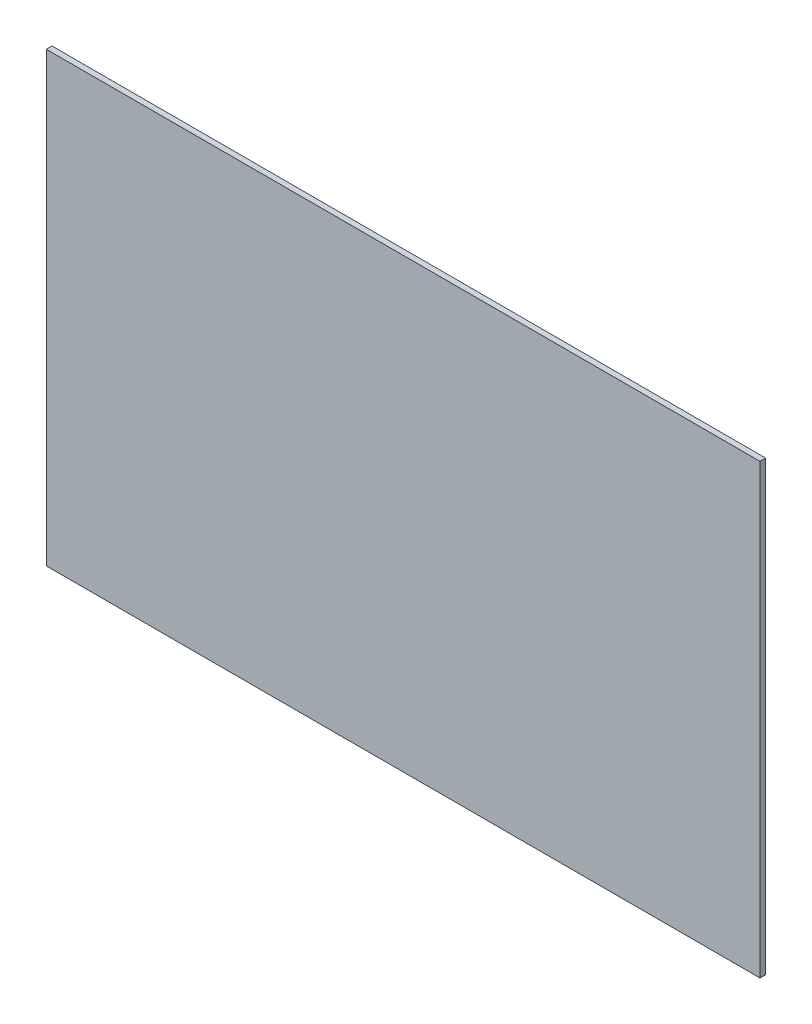
ISO-10303-21;
HEADER;
FILE_DESCRIPTION(('STEP AP214'),'2;1');
FILE_NAME('part.step','',(''),(''),'','','');
FILE_SCHEMA(('AUTOMOTIVE_DESIGN { 1 0 10303 214 1 1 1 1 }'));
ENDSEC;
DATA;
#1=APPLICATION_CONTEXT('core data for automotive mechanical design processes');
#2=APPLICATION_PROTOCOL_DEFINITION('international standard','automotive_design',2000,#1);
#3=PRODUCT_CONTEXT('',#1,'mechanical');
#4=PRODUCT('Part','Part','',(#3));
#5=PRODUCT_RELATED_PRODUCT_CATEGORY('part','',(#4));
#6=PRODUCT_DEFINITION_FORMATION('','',#4);
#7=PRODUCT_DEFINITION_CONTEXT('part definition',#1,'design');
#8=PRODUCT_DEFINITION('design','',#6,#7);
#9=PRODUCT_DEFINITION_SHAPE('','',#8);
#10=(LENGTH_UNIT() NAMED_UNIT(*) SI_UNIT(.MILLI.,.METRE.));
#11=(NAMED_UNIT(*) PLANE_ANGLE_UNIT() SI_UNIT($,.RADIAN.));
#12=(NAMED_UNIT(*) SI_UNIT($,.STERADIAN.) SOLID_ANGLE_UNIT());
#13=UNCERTAINTY_MEASURE_WITH_UNIT(LENGTH_MEASURE(1.E-05),#10,'distance_accuracy_value','');
#14=(GEOMETRIC_REPRESENTATION_CONTEXT(3) GLOBAL_UNCERTAINTY_ASSIGNED_CONTEXT((#13)) GLOBAL_UNIT_ASSIGNED_CONTEXT((#10,
#11,#12)) REPRESENTATION_CONTEXT('',''));
#15=CARTESIAN_POINT('',(0.,0.,0.));
#16=DIRECTION('',(0.,0.,1.));
#17=DIRECTION('',(1.,0.,0.));
#18=AXIS2_PLACEMENT_3D('',#15,#16,#17);
#19=CARTESIAN_POINT('',(-400.05,250.825,6.35));
#20=DIRECTION('',(1.,0.,0.));
#21=DIRECTION('',(0.,1.,0.));
#22=AXIS2_PLACEMENT_3D('',#19,#20,#21);
#23=PLANE('',#22);
#24=DIRECTION('',(0.,-1.,0.));
#25=VECTOR('',#24,1.);
#26=CARTESIAN_POINT('',(-400.05,250.825,0.));
#27=LINE('',#26,#25);
#28=CARTESIAN_POINT('',(-400.05,250.825,0.));
#29=VERTEX_POINT('',#28);
#30=CARTESIAN_POINT('',(-400.05,-250.825,0.));
#31=VERTEX_POINT('',#30);
#32=EDGE_CURVE('E107',#29,#31,#27,.T.);
#33=ORIENTED_EDGE('',*,*,#32,.T.);
#34=DIRECTION('',(0.,0.,-1.));
#35=VECTOR('',#34,1.);
#36=CARTESIAN_POINT('',(-400.05,-250.825,6.35));
#37=LINE('',#36,#35);
#38=CARTESIAN_POINT('',(-400.05,-250.825,6.35));
#39=VERTEX_POINT('',#38);
#40=EDGE_CURVE('E11',#39,#31,#37,.T.);
#41=ORIENTED_EDGE('',*,*,#40,.F.);
#42=DIRECTION('',(0.,-1.,0.));
#43=VECTOR('',#42,1.);
#44=CARTESIAN_POINT('',(-400.05,250.825,6.35));
#45=LINE('',#44,#43);
#46=CARTESIAN_POINT('',(-400.05,250.825,6.35));
#47=VERTEX_POINT('',#46);
#48=EDGE_CURVE('E91',#47,#39,#45,.T.);
#49=ORIENTED_EDGE('',*,*,#48,.F.);
#50=DIRECTION('',(0.,0.,-1.));
#51=VECTOR('',#50,1.);
#52=CARTESIAN_POINT('',(-400.05,250.825,6.35));
#53=LINE('',#52,#51);
#54=EDGE_CURVE('E103',#47,#29,#53,.T.);
#55=ORIENTED_EDGE('',*,*,#54,.T.);
#56=EDGE_LOOP('',(#33,#41,#49,#55));
#57=FACE_BOUND('',#56,.T.);
#58=ADVANCED_FACE('F39',(#57),#23,.F.);
#59=CARTESIAN_POINT('',(400.05,-250.825,6.35));
#60=DIRECTION('',(0.,1.,0.));
#61=DIRECTION('',(-1.,0.,0.));
#62=AXIS2_PLACEMENT_3D('',#59,#60,#61);
#63=PLANE('',#62);
#64=DIRECTION('',(1.,0.,0.));
#65=VECTOR('',#64,1.);
#66=CARTESIAN_POINT('',(400.05,-250.825,0.));
#67=LINE('',#66,#65);
#68=CARTESIAN_POINT('',(400.05,-250.825,0.));
#69=VERTEX_POINT('',#68);
#70=EDGE_CURVE('E96',#31,#69,#67,.T.);
#71=ORIENTED_EDGE('',*,*,#70,.T.);
#72=DIRECTION('',(0.,0.,-1.));
#73=VECTOR('',#72,1.);
#74=CARTESIAN_POINT('',(400.05,-250.825,6.35));
#75=LINE('',#74,#73);
#76=CARTESIAN_POINT('',(400.05,-250.825,6.35));
#77=VERTEX_POINT('',#76);
#78=EDGE_CURVE('E48',#77,#69,#75,.T.);
#79=ORIENTED_EDGE('',*,*,#78,.F.);
#80=DIRECTION('',(1.,0.,0.));
#81=VECTOR('',#80,1.);
#82=CARTESIAN_POINT('',(400.05,-250.825,6.35));
#83=LINE('',#82,#81);
#84=EDGE_CURVE('E86',#39,#77,#83,.T.);
#85=ORIENTED_EDGE('',*,*,#84,.F.);
#86=ORIENTED_EDGE('',*,*,#40,.T.);
#87=EDGE_LOOP('',(#71,#79,#85,#86));
#88=FACE_BOUND('',#87,.T.);
#89=ADVANCED_FACE('F95',(#88),#63,.F.);
#90=CARTESIAN_POINT('',(400.05,250.825,6.35));
#91=DIRECTION('',(-1.,0.,0.));
#92=DIRECTION('',(0.,-1.,0.));
#93=AXIS2_PLACEMENT_3D('',#90,#91,#92);
#94=PLANE('',#93);
#95=DIRECTION('',(0.,1.,0.));
#96=VECTOR('',#95,1.);
#97=CARTESIAN_POINT('',(400.05,250.825,0.));
#98=LINE('',#97,#96);
#99=CARTESIAN_POINT('',(400.05,250.825,0.));
#100=VERTEX_POINT('',#99);
#101=EDGE_CURVE('E73',#69,#100,#98,.T.);
#102=ORIENTED_EDGE('',*,*,#101,.T.);
#103=DIRECTION('',(0.,0.,-1.));
#104=VECTOR('',#103,1.);
#105=CARTESIAN_POINT('',(400.05,250.825,6.35));
#106=LINE('',#105,#104);
#107=CARTESIAN_POINT('',(400.05,250.825,6.35));
#108=VERTEX_POINT('',#107);
#109=EDGE_CURVE('E98',#108,#100,#106,.T.);
#110=ORIENTED_EDGE('',*,*,#109,.F.);
#111=DIRECTION('',(0.,1.,0.));
#112=VECTOR('',#111,1.);
#113=CARTESIAN_POINT('',(400.05,250.825,6.35));
#114=LINE('',#113,#112);
#115=EDGE_CURVE('E89',#77,#108,#114,.T.);
#116=ORIENTED_EDGE('',*,*,#115,.F.);
#117=ORIENTED_EDGE('',*,*,#78,.T.);
#118=EDGE_LOOP('',(#102,#110,#116,#117));
#119=FACE_BOUND('',#118,.T.);
#120=ADVANCED_FACE('F99',(#119),#94,.F.);
#121=CARTESIAN_POINT('',(400.05,250.825,6.35));
#122=DIRECTION('',(0.,-1.,0.));
#123=DIRECTION('',(1.,0.,0.));
#124=AXIS2_PLACEMENT_3D('',#121,#122,#123);
#125=PLANE('',#124);
#126=DIRECTION('',(-1.,0.,0.));
#127=VECTOR('',#126,1.);
#128=CARTESIAN_POINT('',(400.05,250.825,0.));
#129=LINE('',#128,#127);
#130=EDGE_CURVE('E79',#100,#29,#129,.T.);
#131=ORIENTED_EDGE('',*,*,#130,.T.);
#132=ORIENTED_EDGE('',*,*,#54,.F.);
#133=DIRECTION('',(-1.,0.,0.));
#134=VECTOR('',#133,1.);
#135=CARTESIAN_POINT('',(400.05,250.825,6.35));
#136=LINE('',#135,#134);
#137=EDGE_CURVE('E56',#108,#47,#136,.T.);
#138=ORIENTED_EDGE('',*,*,#137,.F.);
#139=ORIENTED_EDGE('',*,*,#109,.T.);
#140=EDGE_LOOP('',(#131,#132,#138,#139));
#141=FACE_BOUND('',#140,.T.);
#142=ADVANCED_FACE('F120',(#141),#125,.F.);
#143=CARTESIAN_POINT('',(0.,0.,6.35));
#144=DIRECTION('',(0.,0.,-1.));
#145=DIRECTION('',(-1.,0.,0.));
#146=AXIS2_PLACEMENT_3D('',#143,#144,#145);
#147=PLANE('',#146);
#148=ORIENTED_EDGE('',*,*,#48,.T.);
#149=ORIENTED_EDGE('',*,*,#84,.T.);
#150=ORIENTED_EDGE('',*,*,#115,.T.);
#151=ORIENTED_EDGE('',*,*,#137,.T.);
#152=EDGE_LOOP('',(#148,#149,#150,#151));
#153=FACE_BOUND('',#152,.T.);
#154=ADVANCED_FACE('F87',(#153),#147,.F.);
#155=CARTESIAN_POINT('',(0.,0.,0.));
#156=DIRECTION('',(0.,0.,-1.));
#157=DIRECTION('',(-1.,0.,0.));
#158=AXIS2_PLACEMENT_3D('',#155,#156,#157);
#159=PLANE('',#158);
#160=ORIENTED_EDGE('',*,*,#32,.F.);
#161=ORIENTED_EDGE('',*,*,#130,.F.);
#162=ORIENTED_EDGE('',*,*,#101,.F.);
#163=ORIENTED_EDGE('',*,*,#70,.F.);
#164=EDGE_LOOP('',(#160,#161,#162,#163));
#165=FACE_BOUND('',#164,.T.);
#166=ADVANCED_FACE('F123',(#165),#159,.T.);
#167=CLOSED_SHELL('',(#58,#89,#120,#142,#154,#166));
#168=MANIFOLD_SOLID_BREP('B2',#167);
#169=ADVANCED_BREP_SHAPE_REPRESENTATION('',(#18,#168),#14);
#170=SHAPE_DEFINITION_REPRESENTATION(#9,#169);
ENDSEC;
END-ISO-10303-21;
